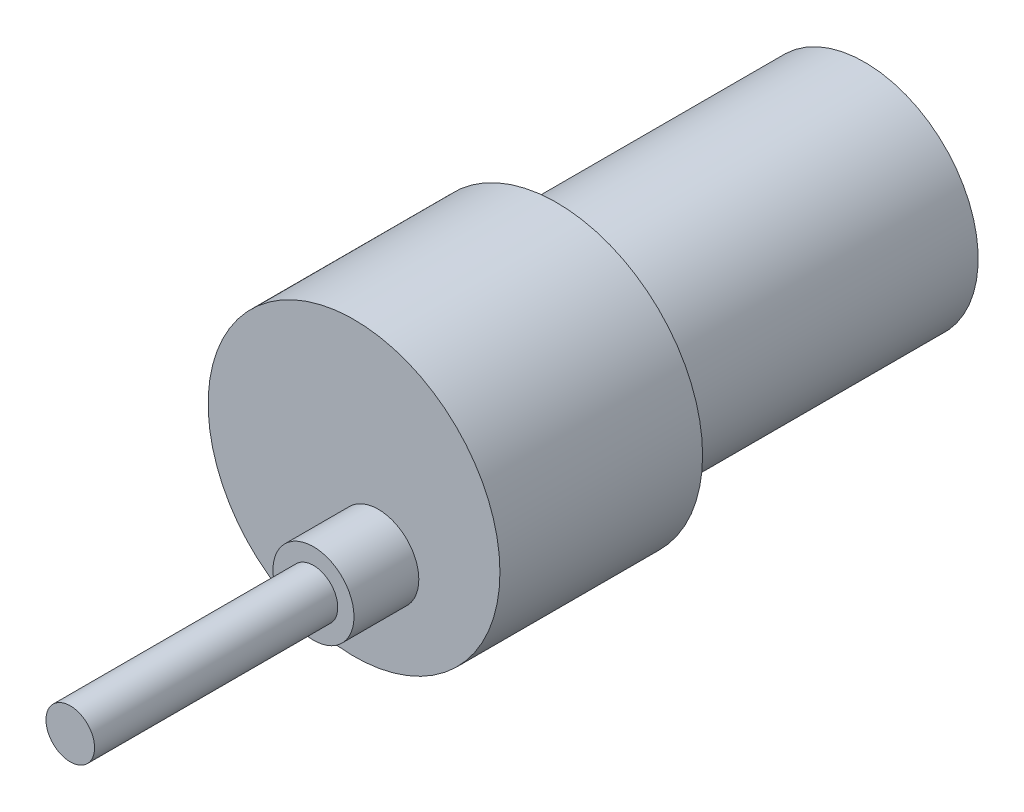
ISO-10303-21;
HEADER;
FILE_DESCRIPTION(('STEP AP214'),'2;1');
FILE_NAME('part.step','',(''),(''),'','','');
FILE_SCHEMA(('AUTOMOTIVE_DESIGN { 1 0 10303 214 1 1 1 1 }'));
ENDSEC;
DATA;
#1=APPLICATION_CONTEXT('core data for automotive mechanical design processes');
#2=APPLICATION_PROTOCOL_DEFINITION('international standard','automotive_design',2000,#1);
#3=PRODUCT_CONTEXT('',#1,'mechanical');
#4=PRODUCT('Part','Part','',(#3));
#5=PRODUCT_RELATED_PRODUCT_CATEGORY('part','',(#4));
#6=PRODUCT_DEFINITION_FORMATION('','',#4);
#7=PRODUCT_DEFINITION_CONTEXT('part definition',#1,'design');
#8=PRODUCT_DEFINITION('design','',#6,#7);
#9=PRODUCT_DEFINITION_SHAPE('','',#8);
#10=(LENGTH_UNIT() NAMED_UNIT(*) SI_UNIT(.MILLI.,.METRE.));
#11=(NAMED_UNIT(*) PLANE_ANGLE_UNIT() SI_UNIT($,.RADIAN.));
#12=(NAMED_UNIT(*) SI_UNIT($,.STERADIAN.) SOLID_ANGLE_UNIT());
#13=UNCERTAINTY_MEASURE_WITH_UNIT(LENGTH_MEASURE(1.E-05),#10,'distance_accuracy_value','');
#14=(GEOMETRIC_REPRESENTATION_CONTEXT(3) GLOBAL_UNCERTAINTY_ASSIGNED_CONTEXT((#13)) GLOBAL_UNIT_ASSIGNED_CONTEXT((#10,
#11,#12)) REPRESENTATION_CONTEXT('',''));
#15=CARTESIAN_POINT('',(0.,0.,0.));
#16=DIRECTION('',(0.,0.,1.));
#17=DIRECTION('',(1.,0.,0.));
#18=AXIS2_PLACEMENT_3D('',#15,#16,#17);
#19=CARTESIAN_POINT('',(0.,0.,25.));
#20=DIRECTION('',(0.,0.,-1.));
#21=DIRECTION('',(-1.,0.,0.));
#22=AXIS2_PLACEMENT_3D('',#19,#20,#21);
#23=CYLINDRICAL_SURFACE('',#22,18.);
#24=CARTESIAN_POINT('',(0.,0.,25.));
#25=DIRECTION('',(0.,0.,1.));
#26=DIRECTION('',(1.,0.,0.));
#27=AXIS2_PLACEMENT_3D('',#24,#25,#26);
#28=CIRCLE('',#27,18.);
#29=CARTESIAN_POINT('',(18.,0.,25.));
#30=VERTEX_POINT('',#29);
#31=EDGE_CURVE('E65',#30,#30,#28,.T.);
#32=ORIENTED_EDGE('',*,*,#31,.F.);
#33=EDGE_LOOP('',(#32));
#34=FACE_BOUND('',#33,.T.);
#35=CARTESIAN_POINT('',(0.,0.,0.));
#36=DIRECTION('',(0.,0.,1.));
#37=DIRECTION('',(1.,0.,0.));
#38=AXIS2_PLACEMENT_3D('',#35,#36,#37);
#39=CIRCLE('',#38,18.);
#40=CARTESIAN_POINT('',(18.,0.,0.));
#41=VERTEX_POINT('',#40);
#42=EDGE_CURVE('E38',#41,#41,#39,.T.);
#43=ORIENTED_EDGE('',*,*,#42,.T.);
#44=EDGE_LOOP('',(#43));
#45=FACE_BOUND('',#44,.T.);
#46=ADVANCED_FACE('F35',(#34,#45),#23,.T.);
#47=CARTESIAN_POINT('',(0.,0.,25.));
#48=DIRECTION('',(0.,0.,1.));
#49=DIRECTION('',(1.,0.,0.));
#50=AXIS2_PLACEMENT_3D('',#47,#48,#49);
#51=PLANE('',#50);
#52=CARTESIAN_POINT('',(2.99164332679952,-5.7706213014905,25.));
#53=DIRECTION('',(0.,0.,1.));
#54=DIRECTION('',(1.,0.,0.));
#55=AXIS2_PLACEMENT_3D('',#52,#53,#54);
#56=CIRCLE('',#55,5.);
#57=CARTESIAN_POINT('',(7.99164332679952,-5.7706213014905,25.));
#58=VERTEX_POINT('',#57);
#59=EDGE_CURVE('E56',#58,#58,#56,.T.);
#60=ORIENTED_EDGE('',*,*,#59,.F.);
#61=EDGE_LOOP('',(#60));
#62=FACE_BOUND('',#61,.T.);
#63=ORIENTED_EDGE('',*,*,#31,.T.);
#64=EDGE_LOOP('',(#63));
#65=FACE_BOUND('',#64,.T.);
#66=ADVANCED_FACE('F76',(#62,#65),#51,.T.);
#67=CARTESIAN_POINT('',(0.,0.,0.));
#68=DIRECTION('',(0.,0.,1.));
#69=DIRECTION('',(1.,0.,0.));
#70=AXIS2_PLACEMENT_3D('',#67,#68,#69);
#71=PLANE('',#70);
#72=CARTESIAN_POINT('',(0.,0.,0.));
#73=DIRECTION('',(0.,0.,-1.));
#74=DIRECTION('',(-1.,0.,0.));
#75=AXIS2_PLACEMENT_3D('',#72,#73,#74);
#76=CIRCLE('',#75,14.);
#77=CARTESIAN_POINT('',(-14.,0.,0.));
#78=VERTEX_POINT('',#77);
#79=EDGE_CURVE('E47',#78,#78,#76,.T.);
#80=ORIENTED_EDGE('',*,*,#79,.F.);
#81=EDGE_LOOP('',(#80));
#82=FACE_BOUND('',#81,.T.);
#83=ORIENTED_EDGE('',*,*,#42,.F.);
#84=EDGE_LOOP('',(#83));
#85=FACE_BOUND('',#84,.T.);
#86=ADVANCED_FACE('F73',(#82,#85),#71,.F.);
#87=CARTESIAN_POINT('',(0.,0.,-38.));
#88=DIRECTION('',(0.,0.,1.));
#89=DIRECTION('',(1.,0.,0.));
#90=AXIS2_PLACEMENT_3D('',#87,#88,#89);
#91=CYLINDRICAL_SURFACE('',#90,14.);
#92=CARTESIAN_POINT('',(0.,0.,-38.));
#93=DIRECTION('',(0.,0.,-1.));
#94=DIRECTION('',(-1.,0.,0.));
#95=AXIS2_PLACEMENT_3D('',#92,#93,#94);
#96=CIRCLE('',#95,14.);
#97=CARTESIAN_POINT('',(-14.,0.,-38.));
#98=VERTEX_POINT('',#97);
#99=EDGE_CURVE('E60',#98,#98,#96,.T.);
#100=ORIENTED_EDGE('',*,*,#99,.F.);
#101=EDGE_LOOP('',(#100));
#102=FACE_BOUND('',#101,.T.);
#103=ORIENTED_EDGE('',*,*,#79,.T.);
#104=EDGE_LOOP('',(#103));
#105=FACE_BOUND('',#104,.T.);
#106=ADVANCED_FACE('F75',(#102,#105),#91,.T.);
#107=CARTESIAN_POINT('',(0.,0.,-38.));
#108=DIRECTION('',(0.,0.,-1.));
#109=DIRECTION('',(-1.,0.,0.));
#110=AXIS2_PLACEMENT_3D('',#107,#108,#109);
#111=PLANE('',#110);
#112=CARTESIAN_POINT('',(0.,0.,-38.));
#113=DIRECTION('',(0.,0.,-1.));
#114=DIRECTION('',(-1.,0.,0.));
#115=AXIS2_PLACEMENT_3D('',#112,#113,#114);
#116=CIRCLE('',#115,5.);
#117=CARTESIAN_POINT('',(-5.,0.,-38.));
#118=VERTEX_POINT('',#117);
#119=EDGE_CURVE('E42',#118,#118,#116,.T.);
#120=ORIENTED_EDGE('',*,*,#119,.F.);
#121=EDGE_LOOP('',(#120));
#122=FACE_BOUND('',#121,.T.);
#123=ORIENTED_EDGE('',*,*,#99,.T.);
#124=EDGE_LOOP('',(#123));
#125=FACE_BOUND('',#124,.T.);
#126=ADVANCED_FACE('F82',(#122,#125),#111,.T.);
#127=CARTESIAN_POINT('',(0.,0.,-40.));
#128=DIRECTION('',(0.,0.,1.));
#129=DIRECTION('',(1.,0.,0.));
#130=AXIS2_PLACEMENT_3D('',#127,#128,#129);
#131=CYLINDRICAL_SURFACE('',#130,5.);
#132=CARTESIAN_POINT('',(0.,0.,-40.));
#133=DIRECTION('',(0.,0.,-1.));
#134=DIRECTION('',(-1.,0.,0.));
#135=AXIS2_PLACEMENT_3D('',#132,#133,#134);
#136=CIRCLE('',#135,5.);
#137=CARTESIAN_POINT('',(-5.,0.,-40.));
#138=VERTEX_POINT('',#137);
#139=EDGE_CURVE('E55',#138,#138,#136,.T.);
#140=ORIENTED_EDGE('',*,*,#139,.F.);
#141=EDGE_LOOP('',(#140));
#142=FACE_BOUND('',#141,.T.);
#143=ORIENTED_EDGE('',*,*,#119,.T.);
#144=EDGE_LOOP('',(#143));
#145=FACE_BOUND('',#144,.T.);
#146=ADVANCED_FACE('F150',(#142,#145),#131,.T.);
#147=CARTESIAN_POINT('',(0.,0.,-40.));
#148=DIRECTION('',(0.,0.,-1.));
#149=DIRECTION('',(-1.,0.,0.));
#150=AXIS2_PLACEMENT_3D('',#147,#148,#149);
#151=PLANE('',#150);
#152=ORIENTED_EDGE('',*,*,#139,.T.);
#153=EDGE_LOOP('',(#152));
#154=FACE_BOUND('',#153,.T.);
#155=ADVANCED_FACE('F103',(#154),#151,.T.);
#156=CARTESIAN_POINT('',(2.99164332679952,-5.7706213014905,33.));
#157=DIRECTION('',(0.,0.,-1.));
#158=DIRECTION('',(-1.,0.,0.));
#159=AXIS2_PLACEMENT_3D('',#156,#157,#158);
#160=CYLINDRICAL_SURFACE('',#159,5.);
#161=CARTESIAN_POINT('',(2.99164332679952,-5.7706213014905,33.));
#162=DIRECTION('',(0.,0.,1.));
#163=DIRECTION('',(1.,0.,0.));
#164=AXIS2_PLACEMENT_3D('',#161,#162,#163);
#165=CIRCLE('',#164,5.);
#166=CARTESIAN_POINT('',(7.99164332679952,-5.7706213014905,33.));
#167=VERTEX_POINT('',#166);
#168=EDGE_CURVE('E52',#167,#167,#165,.T.);
#169=ORIENTED_EDGE('',*,*,#168,.F.);
#170=EDGE_LOOP('',(#169));
#171=FACE_BOUND('',#170,.T.);
#172=ORIENTED_EDGE('',*,*,#59,.T.);
#173=EDGE_LOOP('',(#172));
#174=FACE_BOUND('',#173,.T.);
#175=ADVANCED_FACE('F108',(#171,#174),#160,.T.);
#176=CARTESIAN_POINT('',(0.,0.,33.));
#177=DIRECTION('',(0.,0.,1.));
#178=DIRECTION('',(1.,0.,0.));
#179=AXIS2_PLACEMENT_3D('',#176,#177,#178);
#180=PLANE('',#179);
#181=CARTESIAN_POINT('',(2.99164332679952,-5.7706213014905,33.));
#182=DIRECTION('',(0.,0.,1.));
#183=DIRECTION('',(1.,0.,0.));
#184=AXIS2_PLACEMENT_3D('',#181,#182,#183);
#185=CIRCLE('',#184,3.);
#186=CARTESIAN_POINT('',(5.99164332679952,-5.7706213014905,33.));
#187=VERTEX_POINT('',#186);
#188=EDGE_CURVE('E10',#187,#187,#185,.T.);
#189=ORIENTED_EDGE('',*,*,#188,.F.);
#190=EDGE_LOOP('',(#189));
#191=FACE_BOUND('',#190,.T.);
#192=ORIENTED_EDGE('',*,*,#168,.T.);
#193=EDGE_LOOP('',(#192));
#194=FACE_BOUND('',#193,.T.);
#195=ADVANCED_FACE('F113',(#191,#194),#180,.T.);
#196=CARTESIAN_POINT('',(2.99164332679952,-5.7706213014905,63.));
#197=DIRECTION('',(0.,0.,-1.));
#198=DIRECTION('',(-1.,0.,0.));
#199=AXIS2_PLACEMENT_3D('',#196,#197,#198);
#200=CYLINDRICAL_SURFACE('',#199,3.);
#201=CARTESIAN_POINT('',(2.99164332679952,-5.7706213014905,63.));
#202=DIRECTION('',(0.,0.,1.));
#203=DIRECTION('',(1.,0.,0.));
#204=AXIS2_PLACEMENT_3D('',#201,#202,#203);
#205=CIRCLE('',#204,3.);
#206=CARTESIAN_POINT('',(5.99164332679952,-5.7706213014905,63.));
#207=VERTEX_POINT('',#206);
#208=EDGE_CURVE('E51',#207,#207,#205,.T.);
#209=ORIENTED_EDGE('',*,*,#208,.F.);
#210=EDGE_LOOP('',(#209));
#211=FACE_BOUND('',#210,.T.);
#212=ORIENTED_EDGE('',*,*,#188,.T.);
#213=EDGE_LOOP('',(#212));
#214=FACE_BOUND('',#213,.T.);
#215=ADVANCED_FACE('F123',(#211,#214),#200,.T.);
#216=CARTESIAN_POINT('',(2.99164332679952,-5.7706213014905,63.));
#217=DIRECTION('',(0.,0.,1.));
#218=DIRECTION('',(1.,0.,0.));
#219=AXIS2_PLACEMENT_3D('',#216,#217,#218);
#220=PLANE('',#219);
#221=ORIENTED_EDGE('',*,*,#208,.T.);
#222=EDGE_LOOP('',(#221));
#223=FACE_BOUND('',#222,.T.);
#224=ADVANCED_FACE('F133',(#223),#220,.T.);
#225=CLOSED_SHELL('',(#46,#66,#86,#106,#126,#146,#155,#175,#195,#215,#224));
#226=MANIFOLD_SOLID_BREP('B2',#225);
#227=ADVANCED_BREP_SHAPE_REPRESENTATION('',(#18,#226),#14);
#228=SHAPE_DEFINITION_REPRESENTATION(#9,#227);
ENDSEC;
END-ISO-10303-21;
